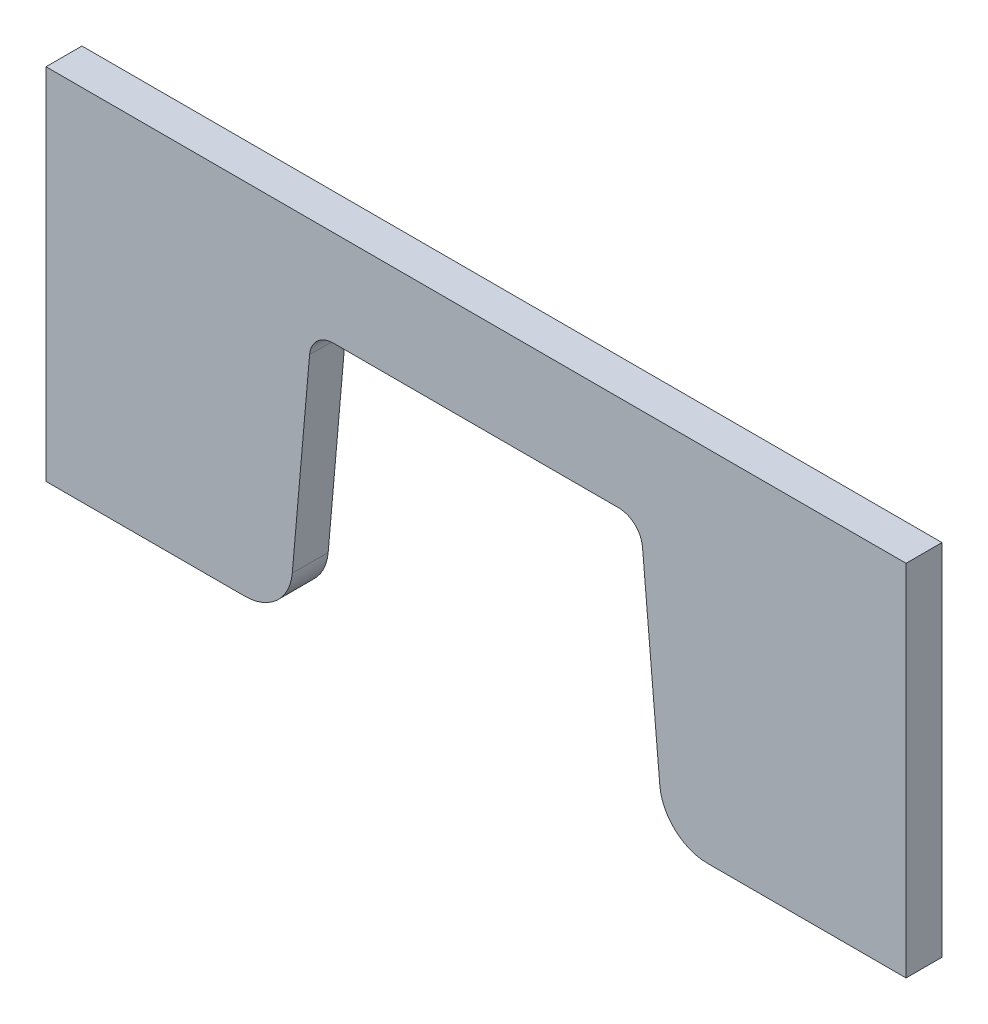
ISO-10303-21;
HEADER;
FILE_DESCRIPTION(('STEP AP214'),'2;1');
FILE_NAME('part.step','',(''),(''),'','','');
FILE_SCHEMA(('AUTOMOTIVE_DESIGN { 1 0 10303 214 1 1 1 1 }'));
ENDSEC;
DATA;
#1=APPLICATION_CONTEXT('core data for automotive mechanical design processes');
#2=APPLICATION_PROTOCOL_DEFINITION('international standard','automotive_design',2000,#1);
#3=PRODUCT_CONTEXT('',#1,'mechanical');
#4=PRODUCT('Part','Part','',(#3));
#5=PRODUCT_RELATED_PRODUCT_CATEGORY('part','',(#4));
#6=PRODUCT_DEFINITION_FORMATION('','',#4);
#7=PRODUCT_DEFINITION_CONTEXT('part definition',#1,'design');
#8=PRODUCT_DEFINITION('design','',#6,#7);
#9=PRODUCT_DEFINITION_SHAPE('','',#8);
#10=(LENGTH_UNIT() NAMED_UNIT(*) SI_UNIT(.MILLI.,.METRE.));
#11=(NAMED_UNIT(*) PLANE_ANGLE_UNIT() SI_UNIT($,.RADIAN.));
#12=(NAMED_UNIT(*) SI_UNIT($,.STERADIAN.) SOLID_ANGLE_UNIT());
#13=UNCERTAINTY_MEASURE_WITH_UNIT(LENGTH_MEASURE(1.E-05),#10,'distance_accuracy_value','');
#14=(GEOMETRIC_REPRESENTATION_CONTEXT(3) GLOBAL_UNCERTAINTY_ASSIGNED_CONTEXT((#13)) GLOBAL_UNIT_ASSIGNED_CONTEXT((#10,
#11,#12)) REPRESENTATION_CONTEXT('',''));
#15=CARTESIAN_POINT('',(0.,0.,0.));
#16=DIRECTION('',(0.,0.,1.));
#17=DIRECTION('',(1.,0.,0.));
#18=AXIS2_PLACEMENT_3D('',#15,#16,#17);
#19=CARTESIAN_POINT('',(-228.088766336441,-273.05,19.05));
#20=DIRECTION('',(1.,0.,0.));
#21=DIRECTION('',(0.,1.,0.));
#22=AXIS2_PLACEMENT_3D('',#19,#20,#21);
#23=PLANE('',#22);
#24=DIRECTION('',(0.,-1.,0.));
#25=VECTOR('',#24,1.);
#26=CARTESIAN_POINT('',(-228.088766336441,-273.05,0.));
#27=LINE('',#26,#25);
#28=CARTESIAN_POINT('',(-228.088766336441,-273.05,0.));
#29=VERTEX_POINT('',#28);
#30=CARTESIAN_POINT('',(-228.088766336441,-463.55,0.));
#31=VERTEX_POINT('',#30);
#32=EDGE_CURVE('E153',#29,#31,#27,.T.);
#33=ORIENTED_EDGE('',*,*,#32,.T.);
#34=DIRECTION('',(0.,0.,-1.));
#35=VECTOR('',#34,1.);
#36=CARTESIAN_POINT('',(-228.088766336441,-463.55,19.05));
#37=LINE('',#36,#35);
#38=CARTESIAN_POINT('',(-228.088766336441,-463.55,19.05));
#39=VERTEX_POINT('',#38);
#40=EDGE_CURVE('E11',#39,#31,#37,.T.);
#41=ORIENTED_EDGE('',*,*,#40,.F.);
#42=DIRECTION('',(0.,-1.,0.));
#43=VECTOR('',#42,1.);
#44=CARTESIAN_POINT('',(-228.088766336441,-273.05,19.05));
#45=LINE('',#44,#43);
#46=CARTESIAN_POINT('',(-228.088766336441,-273.05,19.05));
#47=VERTEX_POINT('',#46);
#48=EDGE_CURVE('E177',#47,#39,#45,.T.);
#49=ORIENTED_EDGE('',*,*,#48,.F.);
#50=DIRECTION('',(0.,0.,-1.));
#51=VECTOR('',#50,1.);
#52=CARTESIAN_POINT('',(-228.088766336441,-273.05,19.05));
#53=LINE('',#52,#51);
#54=EDGE_CURVE('E149',#47,#29,#53,.T.);
#55=ORIENTED_EDGE('',*,*,#54,.T.);
#56=EDGE_LOOP('',(#33,#41,#49,#55));
#57=FACE_BOUND('',#56,.T.);
#58=ADVANCED_FACE('F33',(#57),#23,.F.);
#59=CARTESIAN_POINT('',(-126.488766336441,-463.55,19.05));
#60=DIRECTION('',(0.,1.,0.));
#61=DIRECTION('',(0.,0.,1.));
#62=AXIS2_PLACEMENT_3D('',#59,#60,#61);
#63=PLANE('',#62);
#64=DIRECTION('',(1.,0.,0.));
#65=VECTOR('',#64,1.);
#66=CARTESIAN_POINT('',(-126.488766336441,-463.55,0.));
#67=LINE('',#66,#65);
#68=CARTESIAN_POINT('',(-122.776078156484,-463.55,0.));
#69=VERTEX_POINT('',#68);
#70=EDGE_CURVE('E156',#31,#69,#67,.T.);
#71=ORIENTED_EDGE('',*,*,#70,.T.);
#72=DIRECTION('',(0.,0.,-1.));
#73=VECTOR('',#72,1.);
#74=CARTESIAN_POINT('',(-122.776078156484,-463.55,19.05));
#75=LINE('',#74,#73);
#76=CARTESIAN_POINT('',(-122.776078156484,-463.55,19.05));
#77=VERTEX_POINT('',#76);
#78=EDGE_CURVE('E41',#77,#69,#75,.T.);
#79=ORIENTED_EDGE('',*,*,#78,.F.);
#80=DIRECTION('',(1.,0.,0.));
#81=VECTOR('',#80,1.);
#82=CARTESIAN_POINT('',(-228.088766336441,-463.55,19.05));
#83=LINE('',#82,#81);
#84=EDGE_CURVE('E104',#39,#77,#83,.T.);
#85=ORIENTED_EDGE('',*,*,#84,.F.);
#86=ORIENTED_EDGE('',*,*,#40,.T.);
#87=EDGE_LOOP('',(#71,#79,#85,#86));
#88=FACE_BOUND('',#87,.T.);
#89=ADVANCED_FACE('F204',(#88),#63,.F.);
#90=CARTESIAN_POINT('',(-122.776078156484,-438.15,19.05));
#91=DIRECTION('',(0.,0.,-1.));
#92=DIRECTION('',(-1.,0.,0.));
#93=AXIS2_PLACEMENT_3D('',#90,#91,#92);
#94=CYLINDRICAL_SURFACE('',#93,25.4);
#95=CARTESIAN_POINT('',(-122.776078156484,-438.15,0.));
#96=DIRECTION('',(0.,0.,1.));
#97=DIRECTION('',(1.,0.,0.));
#98=AXIS2_PLACEMENT_3D('',#95,#96,#97);
#99=CIRCLE('',#98,25.4);
#100=CARTESIAN_POINT('',(-97.4727328249532,-440.363755865791,0.));
#101=VERTEX_POINT('',#100);
#102=EDGE_CURVE('E159',#69,#101,#99,.T.);
#103=ORIENTED_EDGE('',*,*,#102,.T.);
#104=DIRECTION('',(0.,0.,-1.));
#105=VECTOR('',#104,1.);
#106=CARTESIAN_POINT('',(-97.4727328249532,-440.363755865791,19.05));
#107=LINE('',#106,#105);
#108=CARTESIAN_POINT('',(-97.4727328249532,-440.363755865791,19.05));
#109=VERTEX_POINT('',#108);
#110=EDGE_CURVE('E196',#109,#101,#107,.T.);
#111=ORIENTED_EDGE('',*,*,#110,.F.);
#112=CARTESIAN_POINT('',(-122.776078156484,-438.15,19.05));
#113=DIRECTION('',(0.,0.,1.));
#114=DIRECTION('',(1.,0.,0.));
#115=AXIS2_PLACEMENT_3D('',#112,#113,#114);
#116=CIRCLE('',#115,25.4);
#117=EDGE_CURVE('E203',#77,#109,#116,.T.);
#118=ORIENTED_EDGE('',*,*,#117,.F.);
#119=ORIENTED_EDGE('',*,*,#78,.T.);
#120=EDGE_LOOP('',(#103,#111,#118,#119));
#121=FACE_BOUND('',#120,.T.);
#122=ADVANCED_FACE('F201',(#121),#94,.T.);
#123=CARTESIAN_POINT('',(-97.4727328249532,-440.363755865791,19.05));
#124=DIRECTION('',(-0.996194698091746,0.0871557427476581,0.));
#125=DIRECTION('',(-0.0871557427476581,-0.996194698091746,0.));
#126=AXIS2_PLACEMENT_3D('',#123,#124,#125);
#127=PLANE('',#126);
#128=DIRECTION('',(0.087155742747658,0.996194698091745,0.));
#129=VECTOR('',#128,1.);
#130=CARTESIAN_POINT('',(-97.4727328249532,-440.363755865791,0.));
#131=LINE('',#130,#129);
#132=CARTESIAN_POINT('',(-88.2891387037293,-335.39479473287,0.));
#133=VERTEX_POINT('',#132);
#134=EDGE_CURVE('E161',#101,#133,#131,.T.);
#135=ORIENTED_EDGE('',*,*,#134,.T.);
#136=DIRECTION('',(0.,0.,-1.));
#137=VECTOR('',#136,1.);
#138=CARTESIAN_POINT('',(-88.2891387037293,-335.39479473287,19.05));
#139=LINE('',#138,#137);
#140=CARTESIAN_POINT('',(-88.2891387037293,-335.39479473287,19.05));
#141=VERTEX_POINT('',#140);
#142=EDGE_CURVE('E193',#141,#133,#139,.T.);
#143=ORIENTED_EDGE('',*,*,#142,.F.);
#144=DIRECTION('',(0.087155742747658,0.996194698091745,0.));
#145=VECTOR('',#144,1.);
#146=CARTESIAN_POINT('',(-97.4727328249532,-440.363755865791,19.05));
#147=LINE('',#146,#145);
#148=EDGE_CURVE('E222',#109,#141,#147,.T.);
#149=ORIENTED_EDGE('',*,*,#148,.F.);
#150=ORIENTED_EDGE('',*,*,#110,.T.);
#151=EDGE_LOOP('',(#135,#143,#149,#150));
#152=FACE_BOUND('',#151,.T.);
#153=ADVANCED_FACE('F213',(#152),#127,.F.);
#154=CARTESIAN_POINT('',(-75.6374660379641,-336.501672665765,19.05));
#155=DIRECTION('',(0.,0.,-1.));
#156=DIRECTION('',(-1.,0.,0.));
#157=AXIS2_PLACEMENT_3D('',#154,#155,#156);
#158=CYLINDRICAL_SURFACE('',#157,12.7);
#159=CARTESIAN_POINT('',(-75.6374660379641,-336.501672665765,0.));
#160=DIRECTION('',(0.,0.,-1.));
#161=DIRECTION('',(1.,0.,0.));
#162=AXIS2_PLACEMENT_3D('',#159,#160,#161);
#163=CIRCLE('',#162,12.7);
#164=CARTESIAN_POINT('',(-75.6374660379641,-323.801672665765,0.));
#165=VERTEX_POINT('',#164);
#166=EDGE_CURVE('E163',#133,#165,#163,.T.);
#167=ORIENTED_EDGE('',*,*,#166,.T.);
#168=DIRECTION('',(0.,0.,-1.));
#169=VECTOR('',#168,1.);
#170=CARTESIAN_POINT('',(-75.6374660379641,-323.801672665765,19.05));
#171=LINE('',#170,#169);
#172=CARTESIAN_POINT('',(-75.6374660379641,-323.801672665765,19.05));
#173=VERTEX_POINT('',#172);
#174=EDGE_CURVE('E190',#173,#165,#171,.T.);
#175=ORIENTED_EDGE('',*,*,#174,.F.);
#176=CARTESIAN_POINT('',(-75.6374660379641,-336.501672665765,19.05));
#177=DIRECTION('',(0.,0.,-1.));
#178=DIRECTION('',(1.,0.,0.));
#179=AXIS2_PLACEMENT_3D('',#176,#177,#178);
#180=CIRCLE('',#179,12.7);
#181=EDGE_CURVE('E219',#141,#173,#180,.T.);
#182=ORIENTED_EDGE('',*,*,#181,.F.);
#183=ORIENTED_EDGE('',*,*,#142,.T.);
#184=EDGE_LOOP('',(#167,#175,#182,#183));
#185=FACE_BOUND('',#184,.T.);
#186=ADVANCED_FACE('F217',(#185),#158,.F.);
#187=CARTESIAN_POINT('',(61.8748719479854,-323.801672665765,19.05));
#188=DIRECTION('',(0.,1.,0.));
#189=DIRECTION('',(0.,0.,1.));
#190=AXIS2_PLACEMENT_3D('',#187,#188,#189);
#191=PLANE('',#190);
#192=DIRECTION('',(1.,0.,0.));
#193=VECTOR('',#192,1.);
#194=CARTESIAN_POINT('',(61.8748719479854,-323.801672665765,0.));
#195=LINE('',#194,#193);
#196=CARTESIAN_POINT('',(75.6374660379641,-323.801672665765,0.));
#197=VERTEX_POINT('',#196);
#198=EDGE_CURVE('E166',#165,#197,#195,.T.);
#199=ORIENTED_EDGE('',*,*,#198,.T.);
#200=DIRECTION('',(0.,0.,-1.));
#201=VECTOR('',#200,1.);
#202=CARTESIAN_POINT('',(75.6374660379641,-323.801672665765,19.05));
#203=LINE('',#202,#201);
#204=CARTESIAN_POINT('',(75.6374660379641,-323.801672665765,19.05));
#205=VERTEX_POINT('',#204);
#206=EDGE_CURVE('E187',#205,#197,#203,.T.);
#207=ORIENTED_EDGE('',*,*,#206,.F.);
#208=DIRECTION('',(1.,0.,0.));
#209=VECTOR('',#208,1.);
#210=CARTESIAN_POINT('',(-61.8748719479854,-323.801672665765,19.05));
#211=LINE('',#210,#209);
#212=EDGE_CURVE('E221',#173,#205,#211,.T.);
#213=ORIENTED_EDGE('',*,*,#212,.F.);
#214=ORIENTED_EDGE('',*,*,#174,.T.);
#215=EDGE_LOOP('',(#199,#207,#213,#214));
#216=FACE_BOUND('',#215,.T.);
#217=ADVANCED_FACE('F246',(#216),#191,.F.);
#218=CARTESIAN_POINT('',(75.6374660379641,-336.501672665765,19.05));
#219=DIRECTION('',(0.,0.,-1.));
#220=DIRECTION('',(-1.,0.,0.));
#221=AXIS2_PLACEMENT_3D('',#218,#219,#220);
#222=CYLINDRICAL_SURFACE('',#221,12.7);
#223=CARTESIAN_POINT('',(75.6374660379641,-336.501672665765,0.));
#224=DIRECTION('',(0.,0.,-1.));
#225=DIRECTION('',(1.,0.,0.));
#226=AXIS2_PLACEMENT_3D('',#223,#224,#225);
#227=CIRCLE('',#226,12.7);
#228=CARTESIAN_POINT('',(88.2891387037293,-335.39479473287,0.));
#229=VERTEX_POINT('',#228);
#230=EDGE_CURVE('E168',#197,#229,#227,.T.);
#231=ORIENTED_EDGE('',*,*,#230,.T.);
#232=DIRECTION('',(0.,0.,-1.));
#233=VECTOR('',#232,1.);
#234=CARTESIAN_POINT('',(88.2891387037293,-335.39479473287,19.05));
#235=LINE('',#234,#233);
#236=CARTESIAN_POINT('',(88.2891387037293,-335.39479473287,19.05));
#237=VERTEX_POINT('',#236);
#238=EDGE_CURVE('E184',#237,#229,#235,.T.);
#239=ORIENTED_EDGE('',*,*,#238,.F.);
#240=CARTESIAN_POINT('',(75.6374660379641,-336.501672665765,19.05));
#241=DIRECTION('',(0.,0.,-1.));
#242=DIRECTION('',(1.,0.,0.));
#243=AXIS2_PLACEMENT_3D('',#240,#241,#242);
#244=CIRCLE('',#243,12.7);
#245=EDGE_CURVE('E224',#205,#237,#244,.T.);
#246=ORIENTED_EDGE('',*,*,#245,.F.);
#247=ORIENTED_EDGE('',*,*,#206,.T.);
#248=EDGE_LOOP('',(#231,#239,#246,#247));
#249=FACE_BOUND('',#248,.T.);
#250=ADVANCED_FACE('F243',(#249),#222,.F.);
#251=CARTESIAN_POINT('',(97.4727328249532,-440.363755865791,19.05));
#252=DIRECTION('',(0.996194698091746,0.0871557427476581,0.));
#253=DIRECTION('',(-0.0871557427476581,0.996194698091746,0.));
#254=AXIS2_PLACEMENT_3D('',#251,#252,#253);
#255=PLANE('',#254);
#256=DIRECTION('',(0.087155742747658,-0.996194698091745,0.));
#257=VECTOR('',#256,1.);
#258=CARTESIAN_POINT('',(97.4727328249532,-440.363755865791,0.));
#259=LINE('',#258,#257);
#260=CARTESIAN_POINT('',(97.4727328249532,-440.363755865791,0.));
#261=VERTEX_POINT('',#260);
#262=EDGE_CURVE('E170',#229,#261,#259,.T.);
#263=ORIENTED_EDGE('',*,*,#262,.T.);
#264=DIRECTION('',(0.,0.,-1.));
#265=VECTOR('',#264,1.);
#266=CARTESIAN_POINT('',(97.4727328249532,-440.363755865791,19.05));
#267=LINE('',#266,#265);
#268=CARTESIAN_POINT('',(97.4727328249532,-440.363755865791,19.05));
#269=VERTEX_POINT('',#268);
#270=EDGE_CURVE('E181',#269,#261,#267,.T.);
#271=ORIENTED_EDGE('',*,*,#270,.F.);
#272=DIRECTION('',(0.087155742747658,-0.996194698091745,0.));
#273=VECTOR('',#272,1.);
#274=CARTESIAN_POINT('',(97.4727328249532,-440.363755865791,19.05));
#275=LINE('',#274,#273);
#276=EDGE_CURVE('E230',#237,#269,#275,.T.);
#277=ORIENTED_EDGE('',*,*,#276,.F.);
#278=ORIENTED_EDGE('',*,*,#238,.T.);
#279=EDGE_LOOP('',(#263,#271,#277,#278));
#280=FACE_BOUND('',#279,.T.);
#281=ADVANCED_FACE('F236',(#280),#255,.F.);
#282=CARTESIAN_POINT('',(122.776078156484,-438.15,19.05));
#283=DIRECTION('',(0.,0.,-1.));
#284=DIRECTION('',(-1.,0.,0.));
#285=AXIS2_PLACEMENT_3D('',#282,#283,#284);
#286=CYLINDRICAL_SURFACE('',#285,25.4);
#287=CARTESIAN_POINT('',(122.776078156484,-438.15,0.));
#288=DIRECTION('',(0.,0.,1.));
#289=DIRECTION('',(1.,0.,0.));
#290=AXIS2_PLACEMENT_3D('',#287,#288,#289);
#291=CIRCLE('',#290,25.4);
#292=CARTESIAN_POINT('',(122.776078156484,-463.55,0.));
#293=VERTEX_POINT('',#292);
#294=EDGE_CURVE('E172',#261,#293,#291,.T.);
#295=ORIENTED_EDGE('',*,*,#294,.T.);
#296=DIRECTION('',(0.,0.,-1.));
#297=VECTOR('',#296,1.);
#298=CARTESIAN_POINT('',(122.776078156484,-463.55,19.05));
#299=LINE('',#298,#297);
#300=CARTESIAN_POINT('',(122.776078156484,-463.55,19.05));
#301=VERTEX_POINT('',#300);
#302=EDGE_CURVE('E144',#301,#293,#299,.T.);
#303=ORIENTED_EDGE('',*,*,#302,.F.);
#304=CARTESIAN_POINT('',(122.776078156484,-438.15,19.05));
#305=DIRECTION('',(0.,0.,1.));
#306=DIRECTION('',(1.,0.,0.));
#307=AXIS2_PLACEMENT_3D('',#304,#305,#306);
#308=CIRCLE('',#307,25.4);
#309=EDGE_CURVE('E135',#269,#301,#308,.T.);
#310=ORIENTED_EDGE('',*,*,#309,.F.);
#311=ORIENTED_EDGE('',*,*,#270,.T.);
#312=EDGE_LOOP('',(#295,#303,#310,#311));
#313=FACE_BOUND('',#312,.T.);
#314=ADVANCED_FACE('F240',(#313),#286,.T.);
#315=CARTESIAN_POINT('',(228.088766336441,-463.55,19.05));
#316=DIRECTION('',(0.,1.,0.));
#317=DIRECTION('',(0.,0.,1.));
#318=AXIS2_PLACEMENT_3D('',#315,#316,#317);
#319=PLANE('',#318);
#320=DIRECTION('',(1.,0.,0.));
#321=VECTOR('',#320,1.);
#322=CARTESIAN_POINT('',(228.088766336441,-463.55,0.));
#323=LINE('',#322,#321);
#324=CARTESIAN_POINT('',(228.088766336441,-463.55,0.));
#325=VERTEX_POINT('',#324);
#326=EDGE_CURVE('E143',#293,#325,#323,.T.);
#327=ORIENTED_EDGE('',*,*,#326,.T.);
#328=DIRECTION('',(0.,0.,-1.));
#329=VECTOR('',#328,1.);
#330=CARTESIAN_POINT('',(228.088766336441,-463.55,19.05));
#331=LINE('',#330,#329);
#332=CARTESIAN_POINT('',(228.088766336441,-463.55,19.05));
#333=VERTEX_POINT('',#332);
#334=EDGE_CURVE('E140',#333,#325,#331,.T.);
#335=ORIENTED_EDGE('',*,*,#334,.F.);
#336=DIRECTION('',(1.,0.,0.));
#337=VECTOR('',#336,1.);
#338=CARTESIAN_POINT('',(228.088766336441,-463.55,19.05));
#339=LINE('',#338,#337);
#340=EDGE_CURVE('E129',#301,#333,#339,.T.);
#341=ORIENTED_EDGE('',*,*,#340,.F.);
#342=ORIENTED_EDGE('',*,*,#302,.T.);
#343=EDGE_LOOP('',(#327,#335,#341,#342));
#344=FACE_BOUND('',#343,.T.);
#345=ADVANCED_FACE('F141',(#344),#319,.F.);
#346=CARTESIAN_POINT('',(228.088766336441,-463.55,19.05));
#347=DIRECTION('',(-1.,0.,0.));
#348=DIRECTION('',(0.,-1.,0.));
#349=AXIS2_PLACEMENT_3D('',#346,#347,#348);
#350=PLANE('',#349);
#351=DIRECTION('',(0.,1.,0.));
#352=VECTOR('',#351,1.);
#353=CARTESIAN_POINT('',(228.088766336441,-463.55,0.));
#354=LINE('',#353,#352);
#355=CARTESIAN_POINT('',(228.088766336441,-273.05,0.));
#356=VERTEX_POINT('',#355);
#357=EDGE_CURVE('E90',#325,#356,#354,.T.);
#358=ORIENTED_EDGE('',*,*,#357,.T.);
#359=DIRECTION('',(0.,0.,-1.));
#360=VECTOR('',#359,1.);
#361=CARTESIAN_POINT('',(228.088766336441,-273.05,19.05));
#362=LINE('',#361,#360);
#363=CARTESIAN_POINT('',(228.088766336441,-273.05,19.05));
#364=VERTEX_POINT('',#363);
#365=EDGE_CURVE('E145',#364,#356,#362,.T.);
#366=ORIENTED_EDGE('',*,*,#365,.F.);
#367=DIRECTION('',(0.,1.,0.));
#368=VECTOR('',#367,1.);
#369=CARTESIAN_POINT('',(228.088766336441,-463.55,19.05));
#370=LINE('',#369,#368);
#371=EDGE_CURVE('E133',#333,#364,#370,.T.);
#372=ORIENTED_EDGE('',*,*,#371,.F.);
#373=ORIENTED_EDGE('',*,*,#334,.T.);
#374=EDGE_LOOP('',(#358,#366,#372,#373));
#375=FACE_BOUND('',#374,.T.);
#376=ADVANCED_FACE('F147',(#375),#350,.F.);
#377=CARTESIAN_POINT('',(228.088766336441,-273.05,19.05));
#378=DIRECTION('',(0.,-1.,0.));
#379=DIRECTION('',(1.,0.,0.));
#380=AXIS2_PLACEMENT_3D('',#377,#378,#379);
#381=PLANE('',#380);
#382=DIRECTION('',(-1.,0.,0.));
#383=VECTOR('',#382,1.);
#384=CARTESIAN_POINT('',(228.088766336441,-273.05,0.));
#385=LINE('',#384,#383);
#386=EDGE_CURVE('E96',#356,#29,#385,.T.);
#387=ORIENTED_EDGE('',*,*,#386,.T.);
#388=ORIENTED_EDGE('',*,*,#54,.F.);
#389=DIRECTION('',(-1.,0.,0.));
#390=VECTOR('',#389,1.);
#391=CARTESIAN_POINT('',(228.088766336441,-273.05,19.05));
#392=LINE('',#391,#390);
#393=EDGE_CURVE('E49',#364,#47,#392,.T.);
#394=ORIENTED_EDGE('',*,*,#393,.F.);
#395=ORIENTED_EDGE('',*,*,#365,.T.);
#396=EDGE_LOOP('',(#387,#388,#394,#395));
#397=FACE_BOUND('',#396,.T.);
#398=ADVANCED_FACE('F261',(#397),#381,.F.);
#399=CARTESIAN_POINT('',(-122.776078156484,-438.15,19.05));
#400=DIRECTION('',(0.,0.,1.));
#401=DIRECTION('',(1.,0.,0.));
#402=AXIS2_PLACEMENT_3D('',#399,#400,#401);
#403=PLANE('',#402);
#404=ORIENTED_EDGE('',*,*,#48,.T.);
#405=ORIENTED_EDGE('',*,*,#84,.T.);
#406=ORIENTED_EDGE('',*,*,#117,.T.);
#407=ORIENTED_EDGE('',*,*,#148,.T.);
#408=ORIENTED_EDGE('',*,*,#181,.T.);
#409=ORIENTED_EDGE('',*,*,#212,.T.);
#410=ORIENTED_EDGE('',*,*,#245,.T.);
#411=ORIENTED_EDGE('',*,*,#276,.T.);
#412=ORIENTED_EDGE('',*,*,#309,.T.);
#413=ORIENTED_EDGE('',*,*,#340,.T.);
#414=ORIENTED_EDGE('',*,*,#371,.T.);
#415=ORIENTED_EDGE('',*,*,#393,.T.);
#416=EDGE_LOOP('',(#404,#405,#406,#407,#408,#409,#410,#411,#412,#413,#414,#415));
#417=FACE_BOUND('',#416,.T.);
#418=ADVANCED_FACE('F131',(#417),#403,.T.);
#419=CARTESIAN_POINT('',(-122.776078156484,-438.15,0.));
#420=DIRECTION('',(0.,0.,1.));
#421=DIRECTION('',(1.,0.,0.));
#422=AXIS2_PLACEMENT_3D('',#419,#420,#421);
#423=PLANE('',#422);
#424=ORIENTED_EDGE('',*,*,#32,.F.);
#425=ORIENTED_EDGE('',*,*,#386,.F.);
#426=ORIENTED_EDGE('',*,*,#357,.F.);
#427=ORIENTED_EDGE('',*,*,#326,.F.);
#428=ORIENTED_EDGE('',*,*,#294,.F.);
#429=ORIENTED_EDGE('',*,*,#262,.F.);
#430=ORIENTED_EDGE('',*,*,#230,.F.);
#431=ORIENTED_EDGE('',*,*,#198,.F.);
#432=ORIENTED_EDGE('',*,*,#166,.F.);
#433=ORIENTED_EDGE('',*,*,#134,.F.);
#434=ORIENTED_EDGE('',*,*,#102,.F.);
#435=ORIENTED_EDGE('',*,*,#70,.F.);
#436=EDGE_LOOP('',(#424,#425,#426,#427,#428,#429,#430,#431,#432,#433,#434,#435));
#437=FACE_BOUND('',#436,.T.);
#438=ADVANCED_FACE('F208',(#437),#423,.F.);
#439=CLOSED_SHELL('',(#58,#89,#122,#153,#186,#217,#250,#281,#314,#345,#376,#398,#418,#438));
#440=MANIFOLD_SOLID_BREP('B2',#439);
#441=ADVANCED_BREP_SHAPE_REPRESENTATION('',(#18,#440),#14);
#442=SHAPE_DEFINITION_REPRESENTATION(#9,#441);
ENDSEC;
END-ISO-10303-21;
